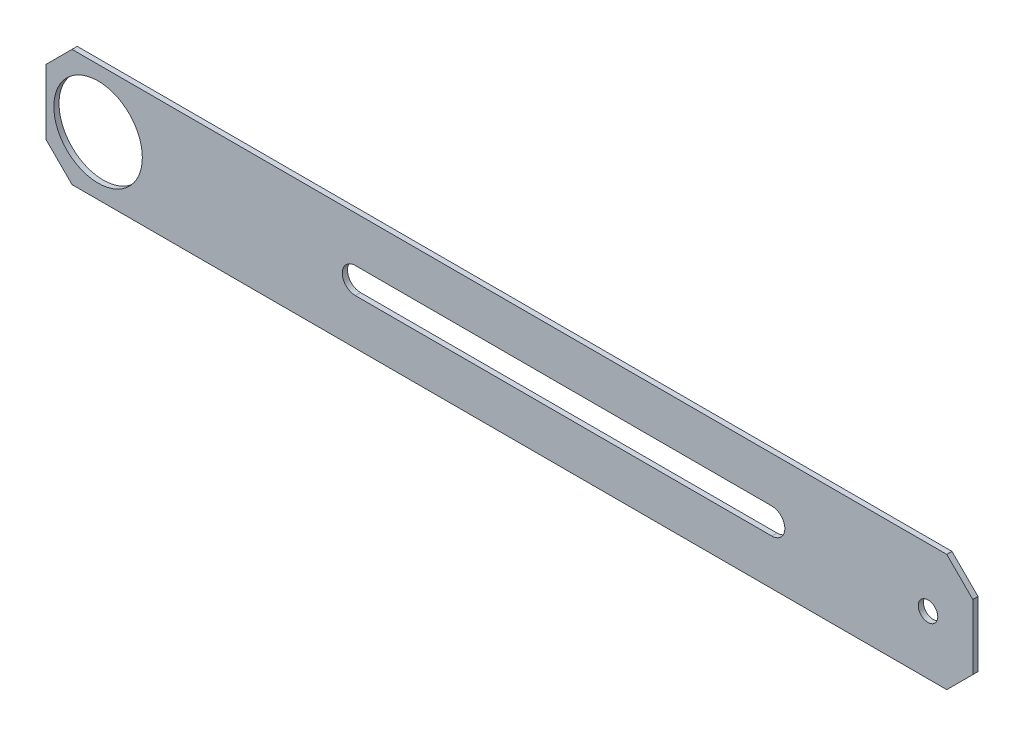
ISO-10303-21;
HEADER;
FILE_DESCRIPTION(('STEP AP214'),'2;1');
FILE_NAME('part.step','',(''),(''),'','','');
FILE_SCHEMA(('AUTOMOTIVE_DESIGN { 1 0 10303 214 1 1 1 1 }'));
ENDSEC;
DATA;
#1=APPLICATION_CONTEXT('core data for automotive mechanical design processes');
#2=APPLICATION_PROTOCOL_DEFINITION('international standard','automotive_design',2000,#1);
#3=PRODUCT_CONTEXT('',#1,'mechanical');
#4=PRODUCT('Part','Part','',(#3));
#5=PRODUCT_RELATED_PRODUCT_CATEGORY('part','',(#4));
#6=PRODUCT_DEFINITION_FORMATION('','',#4);
#7=PRODUCT_DEFINITION_CONTEXT('part definition',#1,'design');
#8=PRODUCT_DEFINITION('design','',#6,#7);
#9=PRODUCT_DEFINITION_SHAPE('','',#8);
#10=(LENGTH_UNIT() NAMED_UNIT(*) SI_UNIT(.MILLI.,.METRE.));
#11=(NAMED_UNIT(*) PLANE_ANGLE_UNIT() SI_UNIT($,.RADIAN.));
#12=(NAMED_UNIT(*) SI_UNIT($,.STERADIAN.) SOLID_ANGLE_UNIT());
#13=UNCERTAINTY_MEASURE_WITH_UNIT(LENGTH_MEASURE(1.E-05),#10,'distance_accuracy_value','');
#14=(GEOMETRIC_REPRESENTATION_CONTEXT(3) GLOBAL_UNCERTAINTY_ASSIGNED_CONTEXT((#13)) GLOBAL_UNIT_ASSIGNED_CONTEXT((#10,
#11,#12)) REPRESENTATION_CONTEXT('',''));
#15=CARTESIAN_POINT('',(0.,0.,0.));
#16=DIRECTION('',(0.,0.,1.));
#17=DIRECTION('',(1.,0.,0.));
#18=AXIS2_PLACEMENT_3D('',#15,#16,#17);
#19=CARTESIAN_POINT('',(0.,0.,5.08));
#20=DIRECTION('',(0.,0.,-1.));
#21=DIRECTION('',(-1.,0.,0.));
#22=AXIS2_PLACEMENT_3D('',#19,#20,#21);
#23=PLANE('',#22);
#24=CARTESIAN_POINT('',(860.552,57.15,5.08));
#25=DIRECTION('',(0.,0.,1.));
#26=DIRECTION('',(1.,0.,0.));
#27=AXIS2_PLACEMENT_3D('',#24,#25,#26);
#28=CIRCLE('',#27,9.52500000000002);
#29=CARTESIAN_POINT('',(870.077,57.15,5.08));
#30=VERTEX_POINT('',#29);
#31=EDGE_CURVE('E187',#30,#30,#28,.T.);
#32=ORIENTED_EDGE('',*,*,#31,.F.);
#33=EDGE_LOOP('',(#32));
#34=FACE_BOUND('',#33,.T.);
#35=CARTESIAN_POINT('',(50.8,57.15,5.08));
#36=DIRECTION('',(0.,0.,1.));
#37=DIRECTION('',(1.,0.,0.));
#38=AXIS2_PLACEMENT_3D('',#35,#36,#37);
#39=CIRCLE('',#38,43.18);
#40=CARTESIAN_POINT('',(93.98,57.15,5.08));
#41=VERTEX_POINT('',#40);
#42=EDGE_CURVE('E195',#41,#41,#39,.T.);
#43=ORIENTED_EDGE('',*,*,#42,.F.);
#44=EDGE_LOOP('',(#43));
#45=FACE_BOUND('',#44,.T.);
#46=DIRECTION('',(1.,0.,0.));
#47=VECTOR('',#46,1.);
#48=CARTESIAN_POINT('',(0.,0.,5.08));
#49=LINE('',#48,#47);
#50=CARTESIAN_POINT('',(25.4,0.,5.08));
#51=VERTEX_POINT('',#50);
#52=CARTESIAN_POINT('',(878.84,0.,5.08));
#53=VERTEX_POINT('',#52);
#54=EDGE_CURVE('E207',#51,#53,#49,.T.);
#55=ORIENTED_EDGE('',*,*,#54,.T.);
#56=DIRECTION('',(-0.707106781186549,-0.707106781186546,0.));
#57=VECTOR('',#56,1.);
#58=CARTESIAN_POINT('',(904.24,25.4,5.08));
#59=LINE('',#58,#57);
#60=CARTESIAN_POINT('',(904.24,25.4,5.08));
#61=VERTEX_POINT('',#60);
#62=EDGE_CURVE('E265',#53,#61,#59,.F.);
#63=ORIENTED_EDGE('',*,*,#62,.T.);
#64=DIRECTION('',(0.,1.,0.));
#65=VECTOR('',#64,1.);
#66=CARTESIAN_POINT('',(904.24,0.,5.08));
#67=LINE('',#66,#65);
#68=CARTESIAN_POINT('',(904.24,88.8999999999999,5.08));
#69=VERTEX_POINT('',#68);
#70=EDGE_CURVE('E212',#61,#69,#67,.T.);
#71=ORIENTED_EDGE('',*,*,#70,.T.);
#72=DIRECTION('',(0.707106781186546,-0.707106781186549,0.));
#73=VECTOR('',#72,1.);
#74=CARTESIAN_POINT('',(878.84,114.3,5.08));
#75=LINE('',#74,#73);
#76=CARTESIAN_POINT('',(878.84,114.3,5.08));
#77=VERTEX_POINT('',#76);
#78=EDGE_CURVE('E65',#69,#77,#75,.F.);
#79=ORIENTED_EDGE('',*,*,#78,.T.);
#80=DIRECTION('',(-1.,0.,0.));
#81=VECTOR('',#80,1.);
#82=CARTESIAN_POINT('',(0.,114.3,5.08));
#83=LINE('',#82,#81);
#84=CARTESIAN_POINT('',(25.4,114.3,5.08));
#85=VERTEX_POINT('',#84);
#86=EDGE_CURVE('E215',#77,#85,#83,.T.);
#87=ORIENTED_EDGE('',*,*,#86,.T.);
#88=DIRECTION('',(0.707106781186549,0.707106781186546,0.));
#89=VECTOR('',#88,1.);
#90=CARTESIAN_POINT('',(0.,88.9000000000001,5.08));
#91=LINE('',#90,#89);
#92=CARTESIAN_POINT('',(0.,88.9000000000001,5.08));
#93=VERTEX_POINT('',#92);
#94=EDGE_CURVE('E257',#85,#93,#91,.F.);
#95=ORIENTED_EDGE('',*,*,#94,.T.);
#96=DIRECTION('',(0.,-1.,0.));
#97=VECTOR('',#96,1.);
#98=CARTESIAN_POINT('',(0.,0.,5.08));
#99=LINE('',#98,#97);
#100=CARTESIAN_POINT('',(0.,25.4000000000001,5.08));
#101=VERTEX_POINT('',#100);
#102=EDGE_CURVE('E203',#93,#101,#99,.T.);
#103=ORIENTED_EDGE('',*,*,#102,.T.);
#104=DIRECTION('',(-0.707106781186546,0.707106781186549,0.));
#105=VECTOR('',#104,1.);
#106=CARTESIAN_POINT('',(25.4,0.,5.08));
#107=LINE('',#106,#105);
#108=EDGE_CURVE('E260',#101,#51,#107,.F.);
#109=ORIENTED_EDGE('',*,*,#108,.T.);
#110=EDGE_LOOP('',(#55,#63,#71,#79,#87,#95,#103,#109));
#111=FACE_BOUND('',#110,.T.);
#112=CARTESIAN_POINT('',(301.752,57.15,5.08));
#113=DIRECTION('',(0.,0.,1.));
#114=DIRECTION('',(1.,0.,0.));
#115=AXIS2_PLACEMENT_3D('',#112,#113,#114);
#116=CIRCLE('',#115,12.7);
#117=CARTESIAN_POINT('',(301.752,69.85,5.08));
#118=VERTEX_POINT('',#117);
#119=CARTESIAN_POINT('',(301.752,44.45,5.08));
#120=VERTEX_POINT('',#119);
#121=EDGE_CURVE('E134',#118,#120,#116,.T.);
#122=ORIENTED_EDGE('',*,*,#121,.F.);
#123=DIRECTION('',(-1.,0.,0.));
#124=VECTOR('',#123,1.);
#125=CARTESIAN_POINT('',(301.752,69.85,5.08));
#126=LINE('',#125,#124);
#127=CARTESIAN_POINT('',(708.152,69.85,5.08));
#128=VERTEX_POINT('',#127);
#129=EDGE_CURVE('E163',#128,#118,#126,.T.);
#130=ORIENTED_EDGE('',*,*,#129,.F.);
#131=CARTESIAN_POINT('',(708.152,57.15,5.08));
#132=DIRECTION('',(0.,0.,1.));
#133=DIRECTION('',(1.,0.,0.));
#134=AXIS2_PLACEMENT_3D('',#131,#132,#133);
#135=CIRCLE('',#134,12.7);
#136=CARTESIAN_POINT('',(708.152,44.45,5.08));
#137=VERTEX_POINT('',#136);
#138=EDGE_CURVE('E159',#137,#128,#135,.T.);
#139=ORIENTED_EDGE('',*,*,#138,.F.);
#140=DIRECTION('',(1.,0.,0.));
#141=VECTOR('',#140,1.);
#142=CARTESIAN_POINT('',(301.752,44.45,5.08));
#143=LINE('',#142,#141);
#144=EDGE_CURVE('E145',#120,#137,#143,.T.);
#145=ORIENTED_EDGE('',*,*,#144,.F.);
#146=EDGE_LOOP('',(#122,#130,#139,#145));
#147=FACE_BOUND('',#146,.T.);
#148=ADVANCED_FACE('F41',(#34,#45,#111,#147),#23,.F.);
#149=CARTESIAN_POINT('',(0.,0.,0.));
#150=DIRECTION('',(0.,0.,-1.));
#151=DIRECTION('',(-1.,0.,0.));
#152=AXIS2_PLACEMENT_3D('',#149,#150,#151);
#153=PLANE('',#152);
#154=CARTESIAN_POINT('',(50.8,57.15,0.));
#155=DIRECTION('',(0.,0.,1.));
#156=DIRECTION('',(1.,0.,0.));
#157=AXIS2_PLACEMENT_3D('',#154,#155,#156);
#158=CIRCLE('',#157,43.18);
#159=CARTESIAN_POINT('',(93.98,57.15,0.));
#160=VERTEX_POINT('',#159);
#161=EDGE_CURVE('E191',#160,#160,#158,.T.);
#162=ORIENTED_EDGE('',*,*,#161,.T.);
#163=EDGE_LOOP('',(#162));
#164=FACE_BOUND('',#163,.T.);
#165=DIRECTION('',(0.,1.,0.));
#166=VECTOR('',#165,1.);
#167=CARTESIAN_POINT('',(904.24,0.,0.));
#168=LINE('',#167,#166);
#169=CARTESIAN_POINT('',(904.24,25.4,0.));
#170=VERTEX_POINT('',#169);
#171=CARTESIAN_POINT('',(904.24,88.8999999999999,0.));
#172=VERTEX_POINT('',#171);
#173=EDGE_CURVE('E226',#170,#172,#168,.T.);
#174=ORIENTED_EDGE('',*,*,#173,.F.);
#175=DIRECTION('',(0.707106781186549,0.707106781186546,0.));
#176=VECTOR('',#175,1.);
#177=CARTESIAN_POINT('',(439.419999999998,-439.42,0.));
#178=LINE('',#177,#176);
#179=CARTESIAN_POINT('',(878.84,0.,0.));
#180=VERTEX_POINT('',#179);
#181=EDGE_CURVE('E247',#170,#180,#178,.F.);
#182=ORIENTED_EDGE('',*,*,#181,.T.);
#183=DIRECTION('',(1.,0.,0.));
#184=VECTOR('',#183,1.);
#185=CARTESIAN_POINT('',(0.,0.,0.));
#186=LINE('',#185,#184);
#187=CARTESIAN_POINT('',(25.4,0.,0.));
#188=VERTEX_POINT('',#187);
#189=EDGE_CURVE('E222',#188,#180,#186,.T.);
#190=ORIENTED_EDGE('',*,*,#189,.F.);
#191=DIRECTION('',(0.707106781186546,-0.707106781186549,0.));
#192=VECTOR('',#191,1.);
#193=CARTESIAN_POINT('',(12.7,12.7,0.));
#194=LINE('',#193,#192);
#195=CARTESIAN_POINT('',(0.,25.4000000000001,0.));
#196=VERTEX_POINT('',#195);
#197=EDGE_CURVE('E241',#188,#196,#194,.F.);
#198=ORIENTED_EDGE('',*,*,#197,.T.);
#199=DIRECTION('',(0.,-1.,0.));
#200=VECTOR('',#199,1.);
#201=CARTESIAN_POINT('',(0.,0.,0.));
#202=LINE('',#201,#200);
#203=CARTESIAN_POINT('',(0.,88.9000000000001,0.));
#204=VERTEX_POINT('',#203);
#205=EDGE_CURVE('E199',#204,#196,#202,.T.);
#206=ORIENTED_EDGE('',*,*,#205,.F.);
#207=DIRECTION('',(-0.707106781186549,-0.707106781186546,0.));
#208=VECTOR('',#207,1.);
#209=CARTESIAN_POINT('',(-44.4500000000001,44.4500000000003,0.));
#210=LINE('',#209,#208);
#211=CARTESIAN_POINT('',(25.4,114.3,0.));
#212=VERTEX_POINT('',#211);
#213=EDGE_CURVE('E238',#204,#212,#210,.F.);
#214=ORIENTED_EDGE('',*,*,#213,.T.);
#215=DIRECTION('',(-1.,0.,0.));
#216=VECTOR('',#215,1.);
#217=CARTESIAN_POINT('',(0.,114.3,0.));
#218=LINE('',#217,#216);
#219=CARTESIAN_POINT('',(878.84,114.3,0.));
#220=VERTEX_POINT('',#219);
#221=EDGE_CURVE('E208',#220,#212,#218,.T.);
#222=ORIENTED_EDGE('',*,*,#221,.F.);
#223=DIRECTION('',(-0.707106781186546,0.707106781186549,0.));
#224=VECTOR('',#223,1.);
#225=CARTESIAN_POINT('',(496.570000000002,496.57,0.));
#226=LINE('',#225,#224);
#227=EDGE_CURVE('E244',#220,#172,#226,.F.);
#228=ORIENTED_EDGE('',*,*,#227,.T.);
#229=EDGE_LOOP('',(#174,#182,#190,#198,#206,#214,#222,#228));
#230=FACE_BOUND('',#229,.T.);
#231=CARTESIAN_POINT('',(860.552,57.15,0.));
#232=DIRECTION('',(0.,0.,1.));
#233=DIRECTION('',(1.,0.,0.));
#234=AXIS2_PLACEMENT_3D('',#231,#232,#233);
#235=CIRCLE('',#234,9.52500000000002);
#236=CARTESIAN_POINT('',(870.077,57.15,0.));
#237=VERTEX_POINT('',#236);
#238=EDGE_CURVE('E154',#237,#237,#235,.T.);
#239=ORIENTED_EDGE('',*,*,#238,.T.);
#240=EDGE_LOOP('',(#239));
#241=FACE_BOUND('',#240,.T.);
#242=DIRECTION('',(-1.,0.,0.));
#243=VECTOR('',#242,1.);
#244=CARTESIAN_POINT('',(301.752,69.85,0.));
#245=LINE('',#244,#243);
#246=CARTESIAN_POINT('',(708.152,69.85,0.));
#247=VERTEX_POINT('',#246);
#248=CARTESIAN_POINT('',(301.752,69.85,0.));
#249=VERTEX_POINT('',#248);
#250=EDGE_CURVE('E146',#247,#249,#245,.T.);
#251=ORIENTED_EDGE('',*,*,#250,.T.);
#252=CARTESIAN_POINT('',(301.752,57.15,0.));
#253=DIRECTION('',(0.,0.,1.));
#254=DIRECTION('',(1.,0.,0.));
#255=AXIS2_PLACEMENT_3D('',#252,#253,#254);
#256=CIRCLE('',#255,12.7);
#257=CARTESIAN_POINT('',(301.752,44.45,0.));
#258=VERTEX_POINT('',#257);
#259=EDGE_CURVE('E168',#249,#258,#256,.T.);
#260=ORIENTED_EDGE('',*,*,#259,.T.);
#261=DIRECTION('',(1.,0.,0.));
#262=VECTOR('',#261,1.);
#263=CARTESIAN_POINT('',(301.752,44.45,0.));
#264=LINE('',#263,#262);
#265=CARTESIAN_POINT('',(708.152,44.45,0.));
#266=VERTEX_POINT('',#265);
#267=EDGE_CURVE('E152',#258,#266,#264,.T.);
#268=ORIENTED_EDGE('',*,*,#267,.T.);
#269=CARTESIAN_POINT('',(708.152,57.15,0.));
#270=DIRECTION('',(0.,0.,1.));
#271=DIRECTION('',(1.,0.,0.));
#272=AXIS2_PLACEMENT_3D('',#269,#270,#271);
#273=CIRCLE('',#272,12.7);
#274=EDGE_CURVE('E173',#266,#247,#273,.T.);
#275=ORIENTED_EDGE('',*,*,#274,.T.);
#276=EDGE_LOOP('',(#251,#260,#268,#275));
#277=FACE_BOUND('',#276,.T.);
#278=ADVANCED_FACE('F285',(#164,#230,#241,#277),#153,.T.);
#279=CARTESIAN_POINT('',(0.,0.,5.08));
#280=DIRECTION('',(1.,0.,0.));
#281=DIRECTION('',(0.,0.,-1.));
#282=AXIS2_PLACEMENT_3D('',#279,#280,#281);
#283=PLANE('',#282);
#284=ORIENTED_EDGE('',*,*,#205,.T.);
#285=DIRECTION('',(0.,0.,1.));
#286=VECTOR('',#285,1.);
#287=CARTESIAN_POINT('',(0.,25.4000000000001,5.08));
#288=LINE('',#287,#286);
#289=EDGE_CURVE('E11',#196,#101,#288,.T.);
#290=ORIENTED_EDGE('',*,*,#289,.T.);
#291=ORIENTED_EDGE('',*,*,#102,.F.);
#292=DIRECTION('',(0.,0.,-1.));
#293=VECTOR('',#292,1.);
#294=CARTESIAN_POINT('',(0.,88.9000000000001,5.08));
#295=LINE('',#294,#293);
#296=EDGE_CURVE('E51',#93,#204,#295,.T.);
#297=ORIENTED_EDGE('',*,*,#296,.T.);
#298=EDGE_LOOP('',(#284,#290,#291,#297));
#299=FACE_BOUND('',#298,.T.);
#300=ADVANCED_FACE('F279',(#299),#283,.F.);
#301=CARTESIAN_POINT('',(0.,0.,5.08));
#302=DIRECTION('',(0.,1.,0.));
#303=DIRECTION('',(0.,0.,1.));
#304=AXIS2_PLACEMENT_3D('',#301,#302,#303);
#305=PLANE('',#304);
#306=ORIENTED_EDGE('',*,*,#189,.T.);
#307=DIRECTION('',(0.,0.,1.));
#308=VECTOR('',#307,1.);
#309=CARTESIAN_POINT('',(878.84,0.,5.08));
#310=LINE('',#309,#308);
#311=EDGE_CURVE('E254',#180,#53,#310,.T.);
#312=ORIENTED_EDGE('',*,*,#311,.T.);
#313=ORIENTED_EDGE('',*,*,#54,.F.);
#314=DIRECTION('',(0.,0.,-1.));
#315=VECTOR('',#314,1.);
#316=CARTESIAN_POINT('',(25.4,0.,5.08));
#317=LINE('',#316,#315);
#318=EDGE_CURVE('E250',#51,#188,#317,.T.);
#319=ORIENTED_EDGE('',*,*,#318,.T.);
#320=EDGE_LOOP('',(#306,#312,#313,#319));
#321=FACE_BOUND('',#320,.T.);
#322=ADVANCED_FACE('F295',(#321),#305,.F.);
#323=CARTESIAN_POINT('',(904.24,0.,5.08));
#324=DIRECTION('',(-1.,0.,0.));
#325=DIRECTION('',(0.,0.,1.));
#326=AXIS2_PLACEMENT_3D('',#323,#324,#325);
#327=PLANE('',#326);
#328=ORIENTED_EDGE('',*,*,#70,.F.);
#329=DIRECTION('',(0.,0.,-1.));
#330=VECTOR('',#329,1.);
#331=CARTESIAN_POINT('',(904.24,25.4,5.08));
#332=LINE('',#331,#330);
#333=EDGE_CURVE('E234',#61,#170,#332,.T.);
#334=ORIENTED_EDGE('',*,*,#333,.T.);
#335=ORIENTED_EDGE('',*,*,#173,.T.);
#336=DIRECTION('',(0.,0.,1.));
#337=VECTOR('',#336,1.);
#338=CARTESIAN_POINT('',(904.24,88.8999999999999,5.08));
#339=LINE('',#338,#337);
#340=EDGE_CURVE('E218',#172,#69,#339,.T.);
#341=ORIENTED_EDGE('',*,*,#340,.T.);
#342=EDGE_LOOP('',(#328,#334,#335,#341));
#343=FACE_BOUND('',#342,.T.);
#344=ADVANCED_FACE('F303',(#343),#327,.F.);
#345=CARTESIAN_POINT('',(0.,114.3,5.08));
#346=DIRECTION('',(0.,-1.,0.));
#347=DIRECTION('',(0.,0.,-1.));
#348=AXIS2_PLACEMENT_3D('',#345,#346,#347);
#349=PLANE('',#348);
#350=ORIENTED_EDGE('',*,*,#86,.F.);
#351=DIRECTION('',(0.,0.,-1.));
#352=VECTOR('',#351,1.);
#353=CARTESIAN_POINT('',(878.84,114.3,5.08));
#354=LINE('',#353,#352);
#355=EDGE_CURVE('E270',#77,#220,#354,.T.);
#356=ORIENTED_EDGE('',*,*,#355,.T.);
#357=ORIENTED_EDGE('',*,*,#221,.T.);
#358=DIRECTION('',(0.,0.,1.));
#359=VECTOR('',#358,1.);
#360=CARTESIAN_POINT('',(25.4,114.3,5.08));
#361=LINE('',#360,#359);
#362=EDGE_CURVE('E58',#212,#85,#361,.T.);
#363=ORIENTED_EDGE('',*,*,#362,.T.);
#364=EDGE_LOOP('',(#350,#356,#357,#363));
#365=FACE_BOUND('',#364,.T.);
#366=ADVANCED_FACE('F308',(#365),#349,.F.);
#367=CARTESIAN_POINT('',(50.8,57.15,5.08));
#368=DIRECTION('',(0.,0.,-1.));
#369=DIRECTION('',(-1.,0.,0.));
#370=AXIS2_PLACEMENT_3D('',#367,#368,#369);
#371=CYLINDRICAL_SURFACE('',#370,43.18);
#372=ORIENTED_EDGE('',*,*,#42,.T.);
#373=EDGE_LOOP('',(#372));
#374=FACE_BOUND('',#373,.T.);
#375=ORIENTED_EDGE('',*,*,#161,.F.);
#376=EDGE_LOOP('',(#375));
#377=FACE_BOUND('',#376,.T.);
#378=ADVANCED_FACE('F324',(#374,#377),#371,.F.);
#379=CARTESIAN_POINT('',(860.552,57.15,5.08));
#380=DIRECTION('',(0.,0.,-1.));
#381=DIRECTION('',(-1.,0.,0.));
#382=AXIS2_PLACEMENT_3D('',#379,#380,#381);
#383=CYLINDRICAL_SURFACE('',#382,9.52500000000002);
#384=ORIENTED_EDGE('',*,*,#31,.T.);
#385=EDGE_LOOP('',(#384));
#386=FACE_BOUND('',#385,.T.);
#387=ORIENTED_EDGE('',*,*,#238,.F.);
#388=EDGE_LOOP('',(#387));
#389=FACE_BOUND('',#388,.T.);
#390=ADVANCED_FACE('F403',(#386,#389),#383,.F.);
#391=CARTESIAN_POINT('',(301.752,57.15,5.08));
#392=DIRECTION('',(0.,0.,-1.));
#393=DIRECTION('',(-1.,0.,0.));
#394=AXIS2_PLACEMENT_3D('',#391,#392,#393);
#395=CYLINDRICAL_SURFACE('',#394,12.7);
#396=ORIENTED_EDGE('',*,*,#259,.F.);
#397=DIRECTION('',(0.,0.,-1.));
#398=VECTOR('',#397,1.);
#399=CARTESIAN_POINT('',(301.752,69.85,5.08));
#400=LINE('',#399,#398);
#401=EDGE_CURVE('E140',#118,#249,#400,.T.);
#402=ORIENTED_EDGE('',*,*,#401,.F.);
#403=ORIENTED_EDGE('',*,*,#121,.T.);
#404=DIRECTION('',(0.,0.,-1.));
#405=VECTOR('',#404,1.);
#406=CARTESIAN_POINT('',(301.752,44.45,5.08));
#407=LINE('',#406,#405);
#408=EDGE_CURVE('E137',#120,#258,#407,.T.);
#409=ORIENTED_EDGE('',*,*,#408,.T.);
#410=EDGE_LOOP('',(#396,#402,#403,#409));
#411=FACE_BOUND('',#410,.T.);
#412=ADVANCED_FACE('F136',(#411),#395,.F.);
#413=CARTESIAN_POINT('',(301.752,44.45,5.08));
#414=DIRECTION('',(0.,1.,0.));
#415=DIRECTION('',(0.,0.,1.));
#416=AXIS2_PLACEMENT_3D('',#413,#414,#415);
#417=PLANE('',#416);
#418=ORIENTED_EDGE('',*,*,#267,.F.);
#419=ORIENTED_EDGE('',*,*,#408,.F.);
#420=ORIENTED_EDGE('',*,*,#144,.T.);
#421=DIRECTION('',(0.,0.,-1.));
#422=VECTOR('',#421,1.);
#423=CARTESIAN_POINT('',(708.152,44.45,5.08));
#424=LINE('',#423,#422);
#425=EDGE_CURVE('E155',#137,#266,#424,.T.);
#426=ORIENTED_EDGE('',*,*,#425,.T.);
#427=EDGE_LOOP('',(#418,#419,#420,#426));
#428=FACE_BOUND('',#427,.T.);
#429=ADVANCED_FACE('F149',(#428),#417,.T.);
#430=CARTESIAN_POINT('',(708.152,57.15,5.08));
#431=DIRECTION('',(0.,0.,-1.));
#432=DIRECTION('',(-1.,0.,0.));
#433=AXIS2_PLACEMENT_3D('',#430,#431,#432);
#434=CYLINDRICAL_SURFACE('',#433,12.7);
#435=ORIENTED_EDGE('',*,*,#274,.F.);
#436=ORIENTED_EDGE('',*,*,#425,.F.);
#437=ORIENTED_EDGE('',*,*,#138,.T.);
#438=DIRECTION('',(0.,0.,-1.));
#439=VECTOR('',#438,1.);
#440=CARTESIAN_POINT('',(708.152,69.85,5.08));
#441=LINE('',#440,#439);
#442=EDGE_CURVE('E182',#128,#247,#441,.T.);
#443=ORIENTED_EDGE('',*,*,#442,.T.);
#444=EDGE_LOOP('',(#435,#436,#437,#443));
#445=FACE_BOUND('',#444,.T.);
#446=ADVANCED_FACE('F379',(#445),#434,.F.);
#447=CARTESIAN_POINT('',(301.752,69.85,5.08));
#448=DIRECTION('',(0.,-1.,0.));
#449=DIRECTION('',(0.,0.,-1.));
#450=AXIS2_PLACEMENT_3D('',#447,#448,#449);
#451=PLANE('',#450);
#452=ORIENTED_EDGE('',*,*,#250,.F.);
#453=ORIENTED_EDGE('',*,*,#442,.F.);
#454=ORIENTED_EDGE('',*,*,#129,.T.);
#455=ORIENTED_EDGE('',*,*,#401,.T.);
#456=EDGE_LOOP('',(#452,#453,#454,#455));
#457=FACE_BOUND('',#456,.T.);
#458=ADVANCED_FACE('F341',(#457),#451,.T.);
#459=CARTESIAN_POINT('',(904.24,25.4,5.08));
#460=DIRECTION('',(-0.707106781186546,0.707106781186549,0.));
#461=DIRECTION('',(0.,0.,-1.));
#462=AXIS2_PLACEMENT_3D('',#459,#460,#461);
#463=PLANE('',#462);
#464=ORIENTED_EDGE('',*,*,#62,.F.);
#465=ORIENTED_EDGE('',*,*,#311,.F.);
#466=ORIENTED_EDGE('',*,*,#181,.F.);
#467=ORIENTED_EDGE('',*,*,#333,.F.);
#468=EDGE_LOOP('',(#464,#465,#466,#467));
#469=FACE_BOUND('',#468,.T.);
#470=ADVANCED_FACE('F301',(#469),#463,.F.);
#471=CARTESIAN_POINT('',(878.84,114.3,5.08));
#472=DIRECTION('',(-0.707106781186549,-0.707106781186546,0.));
#473=DIRECTION('',(0.,0.,-1.));
#474=AXIS2_PLACEMENT_3D('',#471,#472,#473);
#475=PLANE('',#474);
#476=ORIENTED_EDGE('',*,*,#78,.F.);
#477=ORIENTED_EDGE('',*,*,#340,.F.);
#478=ORIENTED_EDGE('',*,*,#227,.F.);
#479=ORIENTED_EDGE('',*,*,#355,.F.);
#480=EDGE_LOOP('',(#476,#477,#478,#479));
#481=FACE_BOUND('',#480,.T.);
#482=ADVANCED_FACE('F307',(#481),#475,.F.);
#483=CARTESIAN_POINT('',(25.4,0.,5.08));
#484=DIRECTION('',(0.707106781186549,0.707106781186546,0.));
#485=DIRECTION('',(0.,0.,-1.));
#486=AXIS2_PLACEMENT_3D('',#483,#484,#485);
#487=PLANE('',#486);
#488=ORIENTED_EDGE('',*,*,#108,.F.);
#489=ORIENTED_EDGE('',*,*,#289,.F.);
#490=ORIENTED_EDGE('',*,*,#197,.F.);
#491=ORIENTED_EDGE('',*,*,#318,.F.);
#492=EDGE_LOOP('',(#488,#489,#490,#491));
#493=FACE_BOUND('',#492,.T.);
#494=ADVANCED_FACE('F292',(#493),#487,.F.);
#495=CARTESIAN_POINT('',(0.,88.9000000000001,5.08));
#496=DIRECTION('',(0.707106781186546,-0.707106781186549,0.));
#497=DIRECTION('',(0.,0.,-1.));
#498=AXIS2_PLACEMENT_3D('',#495,#496,#497);
#499=PLANE('',#498);
#500=ORIENTED_EDGE('',*,*,#94,.F.);
#501=ORIENTED_EDGE('',*,*,#362,.F.);
#502=ORIENTED_EDGE('',*,*,#213,.F.);
#503=ORIENTED_EDGE('',*,*,#296,.F.);
#504=EDGE_LOOP('',(#500,#501,#502,#503));
#505=FACE_BOUND('',#504,.T.);
#506=ADVANCED_FACE('F44',(#505),#499,.F.);
#507=CLOSED_SHELL('',(#148,#278,#300,#322,#344,#366,#378,#390,#412,#429,#446,#458,#470,#482,
#494,#506));
#508=MANIFOLD_SOLID_BREP('B2',#507);
#509=ADVANCED_BREP_SHAPE_REPRESENTATION('',(#18,#508),#14);
#510=SHAPE_DEFINITION_REPRESENTATION(#9,#509);
ENDSEC;
END-ISO-10303-21;
